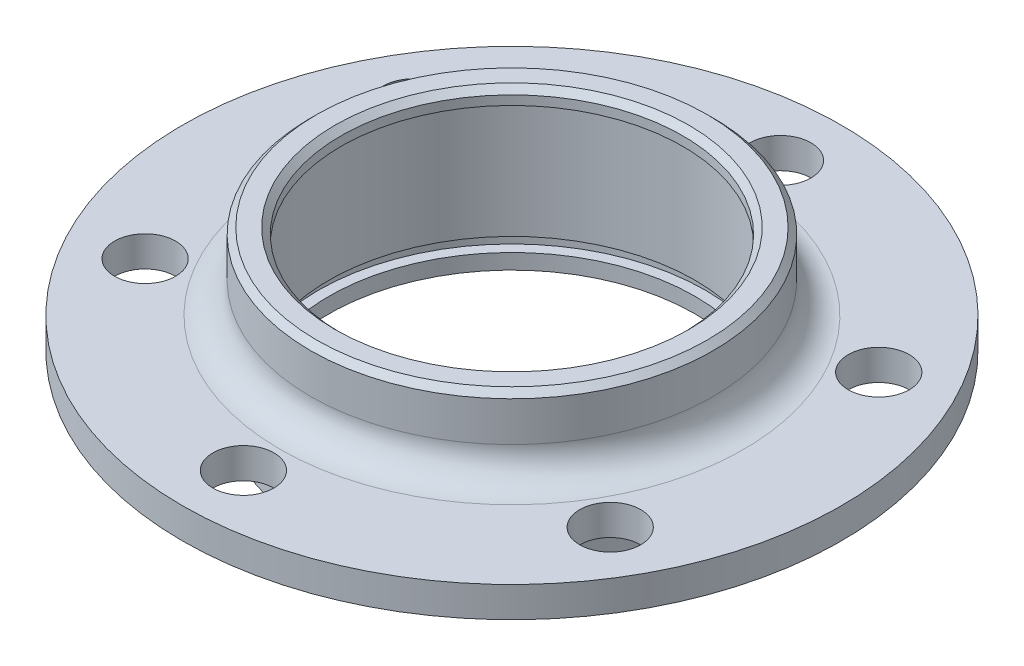
ISO-10303-21;
HEADER;
FILE_DESCRIPTION(('STEP AP214'),'2;1');
FILE_NAME('part.step','',(''),(''),'','','');
FILE_SCHEMA(('AUTOMOTIVE_DESIGN { 1 0 10303 214 1 1 1 1 }'));
ENDSEC;
DATA;
#1=APPLICATION_CONTEXT('core data for automotive mechanical design processes');
#2=APPLICATION_PROTOCOL_DEFINITION('international standard','automotive_design',2000,#1);
#3=PRODUCT_CONTEXT('',#1,'mechanical');
#4=PRODUCT('Part','Part','',(#3));
#5=PRODUCT_RELATED_PRODUCT_CATEGORY('part','',(#4));
#6=PRODUCT_DEFINITION_FORMATION('','',#4);
#7=PRODUCT_DEFINITION_CONTEXT('part definition',#1,'design');
#8=PRODUCT_DEFINITION('design','',#6,#7);
#9=PRODUCT_DEFINITION_SHAPE('','',#8);
#10=(LENGTH_UNIT() NAMED_UNIT(*) SI_UNIT(.MILLI.,.METRE.));
#11=(NAMED_UNIT(*) PLANE_ANGLE_UNIT() SI_UNIT($,.RADIAN.));
#12=(NAMED_UNIT(*) SI_UNIT($,.STERADIAN.) SOLID_ANGLE_UNIT());
#13=UNCERTAINTY_MEASURE_WITH_UNIT(LENGTH_MEASURE(1.E-05),#10,'distance_accuracy_value','');
#14=(GEOMETRIC_REPRESENTATION_CONTEXT(3) GLOBAL_UNCERTAINTY_ASSIGNED_CONTEXT((#13)) GLOBAL_UNIT_ASSIGNED_CONTEXT((#10,
#11,#12)) REPRESENTATION_CONTEXT('',''));
#15=CARTESIAN_POINT('',(0.,0.,0.));
#16=DIRECTION('',(0.,0.,1.));
#17=DIRECTION('',(1.,0.,0.));
#18=AXIS2_PLACEMENT_3D('',#15,#16,#17);
#19=CARTESIAN_POINT('',(0.,-2.5,0.));
#20=DIRECTION('',(0.,1.,0.));
#21=DIRECTION('',(0.,0.,1.));
#22=AXIS2_PLACEMENT_3D('',#19,#20,#21);
#23=CYLINDRICAL_SURFACE('',#22,27.);
#24=CARTESIAN_POINT('',(0.,-2.5,0.));
#25=DIRECTION('',(0.,1.,0.));
#26=DIRECTION('',(0.,0.,1.));
#27=AXIS2_PLACEMENT_3D('',#24,#25,#26);
#28=CIRCLE('',#27,27.);
#29=CARTESIAN_POINT('',(0.,-2.5,27.));
#30=VERTEX_POINT('',#29);
#31=EDGE_CURVE('E48',#30,#30,#28,.T.);
#32=ORIENTED_EDGE('',*,*,#31,.T.);
#33=EDGE_LOOP('',(#32));
#34=FACE_BOUND('',#33,.T.);
#35=CARTESIAN_POINT('',(0.,0.,0.));
#36=DIRECTION('',(0.,1.,0.));
#37=DIRECTION('',(0.,0.,1.));
#38=AXIS2_PLACEMENT_3D('',#35,#36,#37);
#39=CIRCLE('',#38,27.);
#40=CARTESIAN_POINT('',(0.,0.,27.));
#41=VERTEX_POINT('',#40);
#42=EDGE_CURVE('E52',#41,#41,#39,.T.);
#43=ORIENTED_EDGE('',*,*,#42,.F.);
#44=EDGE_LOOP('',(#43));
#45=FACE_BOUND('',#44,.T.);
#46=ADVANCED_FACE('F37',(#34,#45),#23,.T.);
#47=CARTESIAN_POINT('',(0.,-2.5,0.));
#48=DIRECTION('',(0.,1.,0.));
#49=DIRECTION('',(0.,0.,1.));
#50=AXIS2_PLACEMENT_3D('',#47,#48,#49);
#51=PLANE('',#50);
#52=CARTESIAN_POINT('',(0.,-2.5,0.));
#53=DIRECTION('',(0.,1.,0.));
#54=DIRECTION('',(0.,0.,1.));
#55=AXIS2_PLACEMENT_3D('',#52,#53,#54);
#56=CIRCLE('',#55,16.5);
#57=CARTESIAN_POINT('',(0.,-2.5,16.5));
#58=VERTEX_POINT('',#57);
#59=EDGE_CURVE('E91',#58,#58,#56,.T.);
#60=ORIENTED_EDGE('',*,*,#59,.T.);
#61=EDGE_LOOP('',(#60));
#62=FACE_BOUND('',#61,.T.);
#63=CARTESIAN_POINT('',(-19.0525588832576,-2.5,-11.));
#64=DIRECTION('',(0.,1.,0.));
#65=DIRECTION('',(0.,0.,1.));
#66=AXIS2_PLACEMENT_3D('',#63,#64,#65);
#67=CIRCLE('',#66,2.5);
#68=CARTESIAN_POINT('',(-19.0525588832576,-2.5,-8.50000000000001));
#69=VERTEX_POINT('',#68);
#70=EDGE_CURVE('E85',#69,#69,#67,.T.);
#71=ORIENTED_EDGE('',*,*,#70,.T.);
#72=EDGE_LOOP('',(#71));
#73=FACE_BOUND('',#72,.T.);
#74=CARTESIAN_POINT('',(-19.0525588832576,-2.5,11.));
#75=DIRECTION('',(0.,1.,0.));
#76=DIRECTION('',(0.,0.,1.));
#77=AXIS2_PLACEMENT_3D('',#74,#75,#76);
#78=CIRCLE('',#77,2.5);
#79=CARTESIAN_POINT('',(-19.0525588832576,-2.5,13.5));
#80=VERTEX_POINT('',#79);
#81=EDGE_CURVE('E79',#80,#80,#78,.T.);
#82=ORIENTED_EDGE('',*,*,#81,.T.);
#83=EDGE_LOOP('',(#82));
#84=FACE_BOUND('',#83,.T.);
#85=CARTESIAN_POINT('',(0.,-2.5,22.));
#86=DIRECTION('',(0.,1.,0.));
#87=DIRECTION('',(0.,0.,1.));
#88=AXIS2_PLACEMENT_3D('',#85,#86,#87);
#89=CIRCLE('',#88,2.5);
#90=CARTESIAN_POINT('',(0.,-2.5,24.5));
#91=VERTEX_POINT('',#90);
#92=EDGE_CURVE('E73',#91,#91,#89,.T.);
#93=ORIENTED_EDGE('',*,*,#92,.T.);
#94=EDGE_LOOP('',(#93));
#95=FACE_BOUND('',#94,.T.);
#96=CARTESIAN_POINT('',(19.0525588832577,-2.5,11.));
#97=DIRECTION('',(0.,1.,0.));
#98=DIRECTION('',(0.,0.,1.));
#99=AXIS2_PLACEMENT_3D('',#96,#97,#98);
#100=CIRCLE('',#99,2.5);
#101=CARTESIAN_POINT('',(19.0525588832577,-2.5,13.5));
#102=VERTEX_POINT('',#101);
#103=EDGE_CURVE('E67',#102,#102,#100,.T.);
#104=ORIENTED_EDGE('',*,*,#103,.T.);
#105=EDGE_LOOP('',(#104));
#106=FACE_BOUND('',#105,.T.);
#107=CARTESIAN_POINT('',(19.0525588832576,-2.5,-11.));
#108=DIRECTION('',(0.,1.,0.));
#109=DIRECTION('',(0.,0.,1.));
#110=AXIS2_PLACEMENT_3D('',#107,#108,#109);
#111=CIRCLE('',#110,2.5);
#112=CARTESIAN_POINT('',(19.0525588832576,-2.5,-8.5));
#113=VERTEX_POINT('',#112);
#114=EDGE_CURVE('E61',#113,#113,#111,.T.);
#115=ORIENTED_EDGE('',*,*,#114,.T.);
#116=EDGE_LOOP('',(#115));
#117=FACE_BOUND('',#116,.T.);
#118=CARTESIAN_POINT('',(0.,-2.5,-22.));
#119=DIRECTION('',(0.,1.,0.));
#120=DIRECTION('',(0.,0.,1.));
#121=AXIS2_PLACEMENT_3D('',#118,#119,#120);
#122=CIRCLE('',#121,2.5);
#123=CARTESIAN_POINT('',(0.,-2.5,-19.5));
#124=VERTEX_POINT('',#123);
#125=EDGE_CURVE('E56',#124,#124,#122,.T.);
#126=ORIENTED_EDGE('',*,*,#125,.T.);
#127=EDGE_LOOP('',(#126));
#128=FACE_BOUND('',#127,.T.);
#129=ORIENTED_EDGE('',*,*,#31,.F.);
#130=EDGE_LOOP('',(#129));
#131=FACE_BOUND('',#130,.T.);
#132=ADVANCED_FACE('F154',(#62,#73,#84,#95,#106,#117,#128,#131),#51,.F.);
#133=CARTESIAN_POINT('',(0.,0.,0.));
#134=DIRECTION('',(0.,1.,0.));
#135=DIRECTION('',(0.,0.,1.));
#136=AXIS2_PLACEMENT_3D('',#133,#134,#135);
#137=PLANE('',#136);
#138=CARTESIAN_POINT('',(0.,0.,0.));
#139=DIRECTION('',(0.,1.,0.));
#140=DIRECTION('',(0.,0.,1.));
#141=AXIS2_PLACEMENT_3D('',#138,#139,#140);
#142=CIRCLE('',#141,19.);
#143=CARTESIAN_POINT('',(0.,0.,19.));
#144=VERTEX_POINT('',#143);
#145=EDGE_CURVE('E10',#144,#144,#142,.F.);
#146=ORIENTED_EDGE('',*,*,#145,.T.);
#147=EDGE_LOOP('',(#146));
#148=FACE_BOUND('',#147,.T.);
#149=CARTESIAN_POINT('',(-19.0525588832576,0.,-11.));
#150=DIRECTION('',(0.,1.,0.));
#151=DIRECTION('',(0.,0.,1.));
#152=AXIS2_PLACEMENT_3D('',#149,#150,#151);
#153=CIRCLE('',#152,2.5);
#154=CARTESIAN_POINT('',(-19.0525588832576,0.,-8.50000000000001));
#155=VERTEX_POINT('',#154);
#156=EDGE_CURVE('E88',#155,#155,#153,.T.);
#157=ORIENTED_EDGE('',*,*,#156,.F.);
#158=EDGE_LOOP('',(#157));
#159=FACE_BOUND('',#158,.T.);
#160=CARTESIAN_POINT('',(-19.0525588832576,0.,11.));
#161=DIRECTION('',(0.,1.,0.));
#162=DIRECTION('',(0.,0.,1.));
#163=AXIS2_PLACEMENT_3D('',#160,#161,#162);
#164=CIRCLE('',#163,2.5);
#165=CARTESIAN_POINT('',(-19.0525588832576,0.,13.5));
#166=VERTEX_POINT('',#165);
#167=EDGE_CURVE('E82',#166,#166,#164,.T.);
#168=ORIENTED_EDGE('',*,*,#167,.F.);
#169=EDGE_LOOP('',(#168));
#170=FACE_BOUND('',#169,.T.);
#171=CARTESIAN_POINT('',(0.,0.,22.));
#172=DIRECTION('',(0.,1.,0.));
#173=DIRECTION('',(0.,0.,1.));
#174=AXIS2_PLACEMENT_3D('',#171,#172,#173);
#175=CIRCLE('',#174,2.5);
#176=CARTESIAN_POINT('',(0.,0.,24.5));
#177=VERTEX_POINT('',#176);
#178=EDGE_CURVE('E76',#177,#177,#175,.T.);
#179=ORIENTED_EDGE('',*,*,#178,.F.);
#180=EDGE_LOOP('',(#179));
#181=FACE_BOUND('',#180,.T.);
#182=CARTESIAN_POINT('',(19.0525588832577,0.,11.));
#183=DIRECTION('',(0.,1.,0.));
#184=DIRECTION('',(0.,0.,1.));
#185=AXIS2_PLACEMENT_3D('',#182,#183,#184);
#186=CIRCLE('',#185,2.5);
#187=CARTESIAN_POINT('',(19.0525588832577,0.,13.5));
#188=VERTEX_POINT('',#187);
#189=EDGE_CURVE('E70',#188,#188,#186,.T.);
#190=ORIENTED_EDGE('',*,*,#189,.F.);
#191=EDGE_LOOP('',(#190));
#192=FACE_BOUND('',#191,.T.);
#193=CARTESIAN_POINT('',(19.0525588832576,0.,-11.));
#194=DIRECTION('',(0.,1.,0.));
#195=DIRECTION('',(0.,0.,1.));
#196=AXIS2_PLACEMENT_3D('',#193,#194,#195);
#197=CIRCLE('',#196,2.5);
#198=CARTESIAN_POINT('',(19.0525588832576,0.,-8.5));
#199=VERTEX_POINT('',#198);
#200=EDGE_CURVE('E64',#199,#199,#197,.T.);
#201=ORIENTED_EDGE('',*,*,#200,.F.);
#202=EDGE_LOOP('',(#201));
#203=FACE_BOUND('',#202,.T.);
#204=CARTESIAN_POINT('',(0.,0.,-22.));
#205=DIRECTION('',(0.,1.,0.));
#206=DIRECTION('',(0.,0.,1.));
#207=AXIS2_PLACEMENT_3D('',#204,#205,#206);
#208=CIRCLE('',#207,2.5);
#209=CARTESIAN_POINT('',(0.,0.,-19.5));
#210=VERTEX_POINT('',#209);
#211=EDGE_CURVE('E58',#210,#210,#208,.T.);
#212=ORIENTED_EDGE('',*,*,#211,.F.);
#213=EDGE_LOOP('',(#212));
#214=FACE_BOUND('',#213,.T.);
#215=ORIENTED_EDGE('',*,*,#42,.T.);
#216=EDGE_LOOP('',(#215));
#217=FACE_BOUND('',#216,.T.);
#218=ADVANCED_FACE('F159',(#148,#159,#170,#181,#192,#203,#214,#217),#137,.T.);
#219=CARTESIAN_POINT('',(0.,-2.5,-22.));
#220=DIRECTION('',(0.,1.,0.));
#221=DIRECTION('',(0.,0.,1.));
#222=AXIS2_PLACEMENT_3D('',#219,#220,#221);
#223=CYLINDRICAL_SURFACE('',#222,2.5);
#224=ORIENTED_EDGE('',*,*,#125,.F.);
#225=EDGE_LOOP('',(#224));
#226=FACE_BOUND('',#225,.T.);
#227=ORIENTED_EDGE('',*,*,#211,.T.);
#228=EDGE_LOOP('',(#227));
#229=FACE_BOUND('',#228,.T.);
#230=ADVANCED_FACE('F164',(#226,#229),#223,.F.);
#231=CARTESIAN_POINT('',(19.0525588832576,-2.5,-11.));
#232=DIRECTION('',(0.,1.,0.));
#233=DIRECTION('',(0.,0.,1.));
#234=AXIS2_PLACEMENT_3D('',#231,#232,#233);
#235=CYLINDRICAL_SURFACE('',#234,2.5);
#236=ORIENTED_EDGE('',*,*,#114,.F.);
#237=EDGE_LOOP('',(#236));
#238=FACE_BOUND('',#237,.T.);
#239=ORIENTED_EDGE('',*,*,#200,.T.);
#240=EDGE_LOOP('',(#239));
#241=FACE_BOUND('',#240,.T.);
#242=ADVANCED_FACE('F168',(#238,#241),#235,.F.);
#243=CARTESIAN_POINT('',(19.0525588832577,-2.5,11.));
#244=DIRECTION('',(0.,1.,0.));
#245=DIRECTION('',(0.,0.,1.));
#246=AXIS2_PLACEMENT_3D('',#243,#244,#245);
#247=CYLINDRICAL_SURFACE('',#246,2.5);
#248=ORIENTED_EDGE('',*,*,#103,.F.);
#249=EDGE_LOOP('',(#248));
#250=FACE_BOUND('',#249,.T.);
#251=ORIENTED_EDGE('',*,*,#189,.T.);
#252=EDGE_LOOP('',(#251));
#253=FACE_BOUND('',#252,.T.);
#254=ADVANCED_FACE('F172',(#250,#253),#247,.F.);
#255=CARTESIAN_POINT('',(0.,-2.5,22.));
#256=DIRECTION('',(0.,1.,0.));
#257=DIRECTION('',(0.,0.,1.));
#258=AXIS2_PLACEMENT_3D('',#255,#256,#257);
#259=CYLINDRICAL_SURFACE('',#258,2.5);
#260=ORIENTED_EDGE('',*,*,#92,.F.);
#261=EDGE_LOOP('',(#260));
#262=FACE_BOUND('',#261,.T.);
#263=ORIENTED_EDGE('',*,*,#178,.T.);
#264=EDGE_LOOP('',(#263));
#265=FACE_BOUND('',#264,.T.);
#266=ADVANCED_FACE('F176',(#262,#265),#259,.F.);
#267=CARTESIAN_POINT('',(-19.0525588832576,-2.5,11.));
#268=DIRECTION('',(0.,1.,0.));
#269=DIRECTION('',(0.,0.,1.));
#270=AXIS2_PLACEMENT_3D('',#267,#268,#269);
#271=CYLINDRICAL_SURFACE('',#270,2.5);
#272=ORIENTED_EDGE('',*,*,#81,.F.);
#273=EDGE_LOOP('',(#272));
#274=FACE_BOUND('',#273,.T.);
#275=ORIENTED_EDGE('',*,*,#167,.T.);
#276=EDGE_LOOP('',(#275));
#277=FACE_BOUND('',#276,.T.);
#278=ADVANCED_FACE('F180',(#274,#277),#271,.F.);
#279=CARTESIAN_POINT('',(-19.0525588832576,-2.5,-11.));
#280=DIRECTION('',(0.,1.,0.));
#281=DIRECTION('',(0.,0.,1.));
#282=AXIS2_PLACEMENT_3D('',#279,#280,#281);
#283=CYLINDRICAL_SURFACE('',#282,2.5);
#284=ORIENTED_EDGE('',*,*,#70,.F.);
#285=EDGE_LOOP('',(#284));
#286=FACE_BOUND('',#285,.T.);
#287=ORIENTED_EDGE('',*,*,#156,.T.);
#288=EDGE_LOOP('',(#287));
#289=FACE_BOUND('',#288,.T.);
#290=ADVANCED_FACE('F184',(#286,#289),#283,.F.);
#291=CARTESIAN_POINT('',(0.,12.7498857095969,0.));
#292=DIRECTION('',(0.,1.,0.));
#293=DIRECTION('',(0.,0.,1.));
#294=AXIS2_PLACEMENT_3D('',#291,#292,#293);
#295=CYLINDRICAL_SURFACE('',#294,16.5);
#296=CARTESIAN_POINT('',(0.,-6.89,0.));
#297=DIRECTION('',(0.,1.,0.));
#298=DIRECTION('',(0.,0.,1.));
#299=AXIS2_PLACEMENT_3D('',#296,#297,#298);
#300=CIRCLE('',#299,16.5);
#301=CARTESIAN_POINT('',(0.,-6.89,16.5));
#302=VERTEX_POINT('',#301);
#303=EDGE_CURVE('E102',#302,#302,#300,.T.);
#304=ORIENTED_EDGE('',*,*,#303,.T.);
#305=EDGE_LOOP('',(#304));
#306=FACE_BOUND('',#305,.T.);
#307=ORIENTED_EDGE('',*,*,#59,.F.);
#308=EDGE_LOOP('',(#307));
#309=FACE_BOUND('',#308,.T.);
#310=ADVANCED_FACE('F188',(#306,#309),#295,.T.);
#311=CARTESIAN_POINT('',(0.,12.7498857095969,0.));
#312=DIRECTION('',(0.,1.,0.));
#313=DIRECTION('',(0.,0.,1.));
#314=AXIS2_PLACEMENT_3D('',#311,#312,#313);
#315=CYLINDRICAL_SURFACE('',#314,15.);
#316=CARTESIAN_POINT('',(0.,-6.14,0.));
#317=DIRECTION('',(0.,1.,0.));
#318=DIRECTION('',(0.,0.,1.));
#319=AXIS2_PLACEMENT_3D('',#316,#317,#318);
#320=CIRCLE('',#319,15.);
#321=CARTESIAN_POINT('',(0.,-6.14,15.));
#322=VERTEX_POINT('',#321);
#323=EDGE_CURVE('E132',#322,#322,#320,.T.);
#324=ORIENTED_EDGE('',*,*,#323,.T.);
#325=EDGE_LOOP('',(#324));
#326=FACE_BOUND('',#325,.T.);
#327=CARTESIAN_POINT('',(0.,-7.39,0.));
#328=DIRECTION('',(0.,1.,0.));
#329=DIRECTION('',(0.,0.,1.));
#330=AXIS2_PLACEMENT_3D('',#327,#328,#329);
#331=CIRCLE('',#330,15.);
#332=CARTESIAN_POINT('',(0.,-7.39,15.));
#333=VERTEX_POINT('',#332);
#334=EDGE_CURVE('E96',#333,#333,#331,.T.);
#335=ORIENTED_EDGE('',*,*,#334,.F.);
#336=EDGE_LOOP('',(#335));
#337=FACE_BOUND('',#336,.T.);
#338=ADVANCED_FACE('F136',(#326,#337),#315,.F.);
#339=CARTESIAN_POINT('',(0.,-7.39,15.));
#340=DIRECTION('',(0.,-1.,0.));
#341=DIRECTION('',(0.,0.,-1.));
#342=AXIS2_PLACEMENT_3D('',#339,#340,#341);
#343=PLANE('',#342);
#344=ORIENTED_EDGE('',*,*,#334,.T.);
#345=EDGE_LOOP('',(#344));
#346=FACE_BOUND('',#345,.T.);
#347=CARTESIAN_POINT('',(0.,-7.39,0.));
#348=DIRECTION('',(0.,1.,0.));
#349=DIRECTION('',(0.,0.,1.));
#350=AXIS2_PLACEMENT_3D('',#347,#348,#349);
#351=CIRCLE('',#350,16.);
#352=CARTESIAN_POINT('',(0.,-7.39,16.));
#353=VERTEX_POINT('',#352);
#354=EDGE_CURVE('E99',#353,#353,#351,.T.);
#355=ORIENTED_EDGE('',*,*,#354,.F.);
#356=EDGE_LOOP('',(#355));
#357=FACE_BOUND('',#356,.T.);
#358=ADVANCED_FACE('F192',(#346,#357),#343,.T.);
#359=CARTESIAN_POINT('',(0.,-6.89,0.));
#360=DIRECTION('',(0.,1.,0.));
#361=DIRECTION('',(0.,0.,1.));
#362=AXIS2_PLACEMENT_3D('',#359,#360,#361);
#363=CONICAL_SURFACE('',#362,16.5,0.785398163397448);
#364=ORIENTED_EDGE('',*,*,#354,.T.);
#365=EDGE_LOOP('',(#364));
#366=FACE_BOUND('',#365,.T.);
#367=ORIENTED_EDGE('',*,*,#303,.F.);
#368=EDGE_LOOP('',(#367));
#369=FACE_BOUND('',#368,.T.);
#370=ADVANCED_FACE('F195',(#366,#369),#363,.T.);
#371=CARTESIAN_POINT('',(0.,2.5,0.));
#372=DIRECTION('',(0.,1.,0.));
#373=DIRECTION('',(0.,0.,1.));
#374=AXIS2_PLACEMENT_3D('',#371,#372,#373);
#375=CIRCLE('',#374,16.5);
#376=CARTESIAN_POINT('',(0.,2.5,16.5));
#377=VERTEX_POINT('',#376);
#378=EDGE_CURVE('E44',#377,#377,#375,.T.);
#379=ORIENTED_EDGE('',*,*,#378,.T.);
#380=EDGE_LOOP('',(#379));
#381=FACE_BOUND('',#380,.T.);
#382=CARTESIAN_POINT('',(0.,5.75,0.));
#383=DIRECTION('',(0.,1.,0.));
#384=DIRECTION('',(0.,0.,1.));
#385=AXIS2_PLACEMENT_3D('',#382,#383,#384);
#386=CIRCLE('',#385,16.5);
#387=CARTESIAN_POINT('',(0.,5.75,16.5));
#388=VERTEX_POINT('',#387);
#389=EDGE_CURVE('E105',#388,#388,#386,.T.);
#390=ORIENTED_EDGE('',*,*,#389,.F.);
#391=EDGE_LOOP('',(#390));
#392=FACE_BOUND('',#391,.T.);
#393=ADVANCED_FACE('F199',(#381,#392),#295,.T.);
#394=CARTESIAN_POINT('',(0.,6.25,0.));
#395=DIRECTION('',(0.,-1.,0.));
#396=DIRECTION('',(0.,0.,-1.));
#397=AXIS2_PLACEMENT_3D('',#394,#395,#396);
#398=CONICAL_SURFACE('',#397,16.,0.785398163397449);
#399=ORIENTED_EDGE('',*,*,#389,.T.);
#400=EDGE_LOOP('',(#399));
#401=FACE_BOUND('',#400,.T.);
#402=CARTESIAN_POINT('',(0.,6.25,0.));
#403=DIRECTION('',(0.,1.,0.));
#404=DIRECTION('',(0.,0.,1.));
#405=AXIS2_PLACEMENT_3D('',#402,#403,#404);
#406=CIRCLE('',#405,16.);
#407=CARTESIAN_POINT('',(0.,6.25,16.));
#408=VERTEX_POINT('',#407);
#409=EDGE_CURVE('E108',#408,#408,#406,.T.);
#410=ORIENTED_EDGE('',*,*,#409,.F.);
#411=EDGE_LOOP('',(#410));
#412=FACE_BOUND('',#411,.T.);
#413=ADVANCED_FACE('F203',(#401,#412),#398,.T.);
#414=CARTESIAN_POINT('',(0.,6.25,14.9928621024965));
#415=DIRECTION('',(0.,1.,0.));
#416=DIRECTION('',(0.,0.,1.));
#417=AXIS2_PLACEMENT_3D('',#414,#415,#416);
#418=PLANE('',#417);
#419=ORIENTED_EDGE('',*,*,#409,.T.);
#420=EDGE_LOOP('',(#419));
#421=FACE_BOUND('',#420,.T.);
#422=CARTESIAN_POINT('',(0.,6.25,0.));
#423=DIRECTION('',(0.,1.,0.));
#424=DIRECTION('',(0.,0.,1.));
#425=AXIS2_PLACEMENT_3D('',#422,#423,#424);
#426=CIRCLE('',#425,14.5);
#427=CARTESIAN_POINT('',(0.,6.25,14.5));
#428=VERTEX_POINT('',#427);
#429=EDGE_CURVE('E111',#428,#428,#426,.T.);
#430=ORIENTED_EDGE('',*,*,#429,.F.);
#431=EDGE_LOOP('',(#430));
#432=FACE_BOUND('',#431,.T.);
#433=ADVANCED_FACE('F206',(#421,#432),#418,.T.);
#434=CARTESIAN_POINT('',(0.,5.75,0.));
#435=DIRECTION('',(0.,1.,0.));
#436=DIRECTION('',(0.,0.,1.));
#437=AXIS2_PLACEMENT_3D('',#434,#435,#436);
#438=CONICAL_SURFACE('',#437,14.,0.785398163397447);
#439=ORIENTED_EDGE('',*,*,#429,.T.);
#440=EDGE_LOOP('',(#439));
#441=FACE_BOUND('',#440,.T.);
#442=CARTESIAN_POINT('',(0.,5.75,0.));
#443=DIRECTION('',(0.,1.,0.));
#444=DIRECTION('',(0.,0.,1.));
#445=AXIS2_PLACEMENT_3D('',#442,#443,#444);
#446=CIRCLE('',#445,14.);
#447=CARTESIAN_POINT('',(0.,5.75,14.));
#448=VERTEX_POINT('',#447);
#449=EDGE_CURVE('E114',#448,#448,#446,.T.);
#450=ORIENTED_EDGE('',*,*,#449,.F.);
#451=EDGE_LOOP('',(#450));
#452=FACE_BOUND('',#451,.T.);
#453=ADVANCED_FACE('F210',(#441,#452),#438,.F.);
#454=CARTESIAN_POINT('',(0.,12.7498857095969,0.));
#455=DIRECTION('',(0.,1.,0.));
#456=DIRECTION('',(0.,0.,1.));
#457=AXIS2_PLACEMENT_3D('',#454,#455,#456);
#458=CYLINDRICAL_SURFACE('',#457,14.);
#459=ORIENTED_EDGE('',*,*,#449,.T.);
#460=EDGE_LOOP('',(#459));
#461=FACE_BOUND('',#460,.T.);
#462=CARTESIAN_POINT('',(0.,5.,0.));
#463=DIRECTION('',(0.,1.,0.));
#464=DIRECTION('',(0.,0.,1.));
#465=AXIS2_PLACEMENT_3D('',#462,#463,#464);
#466=CIRCLE('',#465,14.);
#467=CARTESIAN_POINT('',(0.,5.,14.));
#468=VERTEX_POINT('',#467);
#469=EDGE_CURVE('E117',#468,#468,#466,.T.);
#470=ORIENTED_EDGE('',*,*,#469,.F.);
#471=EDGE_LOOP('',(#470));
#472=FACE_BOUND('',#471,.T.);
#473=ADVANCED_FACE('F214',(#461,#472),#458,.F.);
#474=CARTESIAN_POINT('',(0.,5.,15.));
#475=DIRECTION('',(0.,-1.,0.));
#476=DIRECTION('',(0.,0.,-1.));
#477=AXIS2_PLACEMENT_3D('',#474,#475,#476);
#478=PLANE('',#477);
#479=ORIENTED_EDGE('',*,*,#469,.T.);
#480=EDGE_LOOP('',(#479));
#481=FACE_BOUND('',#480,.T.);
#482=CARTESIAN_POINT('',(0.,5.,0.));
#483=DIRECTION('',(0.,1.,0.));
#484=DIRECTION('',(0.,0.,1.));
#485=AXIS2_PLACEMENT_3D('',#482,#483,#484);
#486=CIRCLE('',#485,15.);
#487=CARTESIAN_POINT('',(0.,5.,15.));
#488=VERTEX_POINT('',#487);
#489=EDGE_CURVE('E120',#488,#488,#486,.T.);
#490=ORIENTED_EDGE('',*,*,#489,.F.);
#491=EDGE_LOOP('',(#490));
#492=FACE_BOUND('',#491,.T.);
#493=ADVANCED_FACE('F218',(#481,#492),#478,.T.);
#494=CARTESIAN_POINT('',(0.,12.7498857095969,0.));
#495=DIRECTION('',(0.,1.,0.));
#496=DIRECTION('',(0.,0.,1.));
#497=AXIS2_PLACEMENT_3D('',#494,#495,#496);
#498=CYLINDRICAL_SURFACE('',#497,15.);
#499=ORIENTED_EDGE('',*,*,#489,.T.);
#500=EDGE_LOOP('',(#499));
#501=FACE_BOUND('',#500,.T.);
#502=CARTESIAN_POINT('',(0.,-5.,0.));
#503=DIRECTION('',(0.,1.,0.));
#504=DIRECTION('',(0.,0.,1.));
#505=AXIS2_PLACEMENT_3D('',#502,#503,#504);
#506=CIRCLE('',#505,15.);
#507=CARTESIAN_POINT('',(0.,-5.,15.));
#508=VERTEX_POINT('',#507);
#509=EDGE_CURVE('E123',#508,#508,#506,.T.);
#510=ORIENTED_EDGE('',*,*,#509,.F.);
#511=EDGE_LOOP('',(#510));
#512=FACE_BOUND('',#511,.T.);
#513=ADVANCED_FACE('F222',(#501,#512),#498,.F.);
#514=CARTESIAN_POINT('',(0.,-5.,15.));
#515=DIRECTION('',(0.,-1.,0.));
#516=DIRECTION('',(0.,0.,-1.));
#517=AXIS2_PLACEMENT_3D('',#514,#515,#516);
#518=PLANE('',#517);
#519=ORIENTED_EDGE('',*,*,#509,.T.);
#520=EDGE_LOOP('',(#519));
#521=FACE_BOUND('',#520,.T.);
#522=CARTESIAN_POINT('',(0.,-5.,0.));
#523=DIRECTION('',(0.,1.,0.));
#524=DIRECTION('',(0.,0.,1.));
#525=AXIS2_PLACEMENT_3D('',#522,#523,#524);
#526=CIRCLE('',#525,15.855);
#527=CARTESIAN_POINT('',(0.,-5.,15.855));
#528=VERTEX_POINT('',#527);
#529=EDGE_CURVE('E126',#528,#528,#526,.T.);
#530=ORIENTED_EDGE('',*,*,#529,.F.);
#531=EDGE_LOOP('',(#530));
#532=FACE_BOUND('',#531,.T.);
#533=ADVANCED_FACE('F150',(#521,#532),#518,.T.);
#534=CARTESIAN_POINT('',(0.,12.7498857095969,0.));
#535=DIRECTION('',(0.,1.,0.));
#536=DIRECTION('',(0.,0.,1.));
#537=AXIS2_PLACEMENT_3D('',#534,#535,#536);
#538=CYLINDRICAL_SURFACE('',#537,15.855);
#539=ORIENTED_EDGE('',*,*,#529,.T.);
#540=EDGE_LOOP('',(#539));
#541=FACE_BOUND('',#540,.T.);
#542=CARTESIAN_POINT('',(0.,-6.14,0.));
#543=DIRECTION('',(0.,1.,0.));
#544=DIRECTION('',(0.,0.,1.));
#545=AXIS2_PLACEMENT_3D('',#542,#543,#544);
#546=CIRCLE('',#545,15.855);
#547=CARTESIAN_POINT('',(0.,-6.14,15.855));
#548=VERTEX_POINT('',#547);
#549=EDGE_CURVE('E129',#548,#548,#546,.T.);
#550=ORIENTED_EDGE('',*,*,#549,.F.);
#551=EDGE_LOOP('',(#550));
#552=FACE_BOUND('',#551,.T.);
#553=ADVANCED_FACE('F141',(#541,#552),#538,.F.);
#554=CARTESIAN_POINT('',(0.,-6.14,15.));
#555=DIRECTION('',(0.,1.,0.));
#556=DIRECTION('',(0.,0.,1.));
#557=AXIS2_PLACEMENT_3D('',#554,#555,#556);
#558=PLANE('',#557);
#559=ORIENTED_EDGE('',*,*,#549,.T.);
#560=EDGE_LOOP('',(#559));
#561=FACE_BOUND('',#560,.T.);
#562=ORIENTED_EDGE('',*,*,#323,.F.);
#563=EDGE_LOOP('',(#562));
#564=FACE_BOUND('',#563,.T.);
#565=ADVANCED_FACE('F139',(#561,#564),#558,.T.);
#566=CARTESIAN_POINT('',(0.,2.5,0.));
#567=DIRECTION('',(0.,1.,0.));
#568=DIRECTION('',(0.,0.,1.));
#569=AXIS2_PLACEMENT_3D('',#566,#567,#568);
#570=TOROIDAL_SURFACE('',#569,19.,2.5);
#571=ORIENTED_EDGE('',*,*,#145,.F.);
#572=EDGE_LOOP('',(#571));
#573=FACE_BOUND('',#572,.T.);
#574=ORIENTED_EDGE('',*,*,#378,.F.);
#575=EDGE_LOOP('',(#574));
#576=FACE_BOUND('',#575,.T.);
#577=ADVANCED_FACE('F39',(#573,#576),#570,.F.);
#578=CLOSED_SHELL('',(#46,#132,#218,#230,#242,#254,#266,#278,#290,#310,#338,#358,#370,#393,#413,
#433,#453,#473,#493,#513,#533,#553,#565,#577));
#579=MANIFOLD_SOLID_BREP('B2',#578);
#580=ADVANCED_BREP_SHAPE_REPRESENTATION('',(#18,#579),#14);
#581=SHAPE_DEFINITION_REPRESENTATION(#9,#580);
ENDSEC;
END-ISO-10303-21;
